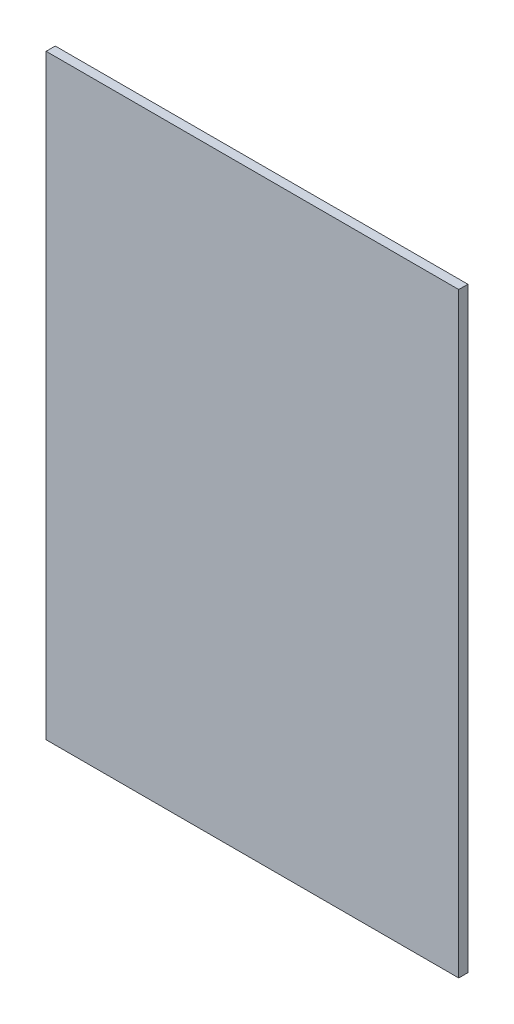
ISO-10303-21;
HEADER;
FILE_DESCRIPTION(('STEP AP214'),'2;1');
FILE_NAME('part.step','',(''),(''),'','','');
FILE_SCHEMA(('AUTOMOTIVE_DESIGN { 1 0 10303 214 1 1 1 1 }'));
ENDSEC;
DATA;
#1=APPLICATION_CONTEXT('core data for automotive mechanical design processes');
#2=APPLICATION_PROTOCOL_DEFINITION('international standard','automotive_design',2000,#1);
#3=PRODUCT_CONTEXT('',#1,'mechanical');
#4=PRODUCT('Part','Part','',(#3));
#5=PRODUCT_RELATED_PRODUCT_CATEGORY('part','',(#4));
#6=PRODUCT_DEFINITION_FORMATION('','',#4);
#7=PRODUCT_DEFINITION_CONTEXT('part definition',#1,'design');
#8=PRODUCT_DEFINITION('design','',#6,#7);
#9=PRODUCT_DEFINITION_SHAPE('','',#8);
#10=(LENGTH_UNIT() NAMED_UNIT(*) SI_UNIT(.MILLI.,.METRE.));
#11=(NAMED_UNIT(*) PLANE_ANGLE_UNIT() SI_UNIT($,.RADIAN.));
#12=(NAMED_UNIT(*) SI_UNIT($,.STERADIAN.) SOLID_ANGLE_UNIT());
#13=UNCERTAINTY_MEASURE_WITH_UNIT(LENGTH_MEASURE(1.E-05),#10,'distance_accuracy_value','');
#14=(GEOMETRIC_REPRESENTATION_CONTEXT(3) GLOBAL_UNCERTAINTY_ASSIGNED_CONTEXT((#13)) GLOBAL_UNIT_ASSIGNED_CONTEXT((#10,
#11,#12)) REPRESENTATION_CONTEXT('',''));
#15=CARTESIAN_POINT('',(0.,0.,0.));
#16=DIRECTION('',(0.,0.,1.));
#17=DIRECTION('',(1.,0.,0.));
#18=AXIS2_PLACEMENT_3D('',#15,#16,#17);
#19=CARTESIAN_POINT('',(-1.15320064,-2.8194,0.3999992));
#20=DIRECTION('',(-1.,0.,0.));
#21=DIRECTION('',(0.,1.,0.));
#22=AXIS2_PLACEMENT_3D('',#19,#20,#21);
#23=PLANE('',#22);
#24=DIRECTION('',(0.,0.,1.));
#25=VECTOR('',#24,1.);
#26=CARTESIAN_POINT('',(-1.15320064,-2.8194,0.3999992));
#27=LINE('',#26,#25);
#28=CARTESIAN_POINT('',(-1.15320064,-2.8194,0.3999992));
#29=VERTEX_POINT('',#28);
#30=CARTESIAN_POINT('',(-1.15320064,-2.8194,0.499999));
#31=VERTEX_POINT('',#30);
#32=EDGE_CURVE('E10',#29,#31,#27,.T.);
#33=ORIENTED_EDGE('',*,*,#32,.T.);
#34=DIRECTION('',(0.,1.,0.));
#35=VECTOR('',#34,1.);
#36=CARTESIAN_POINT('',(-1.15320064,-2.8194,0.499999));
#37=LINE('',#36,#35);
#38=CARTESIAN_POINT('',(-1.15320064,3.69160044,0.499999));
#39=VERTEX_POINT('',#38);
#40=EDGE_CURVE('E23',#31,#39,#37,.T.);
#41=ORIENTED_EDGE('',*,*,#40,.T.);
#42=DIRECTION('',(0.,0.,1.));
#43=VECTOR('',#42,1.);
#44=CARTESIAN_POINT('',(-1.15320064,3.69160044,0.3999992));
#45=LINE('',#44,#43);
#46=CARTESIAN_POINT('',(-1.15320064,3.69160044,0.3999992));
#47=VERTEX_POINT('',#46);
#48=EDGE_CURVE('E82',#47,#39,#45,.T.);
#49=ORIENTED_EDGE('',*,*,#48,.F.);
#50=DIRECTION('',(0.,1.,0.));
#51=VECTOR('',#50,1.);
#52=CARTESIAN_POINT('',(-1.15320064,-2.8194,0.3999992));
#53=LINE('',#52,#51);
#54=EDGE_CURVE('E80',#29,#47,#53,.T.);
#55=ORIENTED_EDGE('',*,*,#54,.F.);
#56=EDGE_LOOP('',(#33,#41,#49,#55));
#57=FACE_BOUND('',#56,.T.);
#58=ADVANCED_FACE('F16',(#57),#23,.T.);
#59=CARTESIAN_POINT('',(-1.15320064,3.69160044,0.3999992));
#60=DIRECTION('',(0.,1.,0.));
#61=DIRECTION('',(1.,0.,0.));
#62=AXIS2_PLACEMENT_3D('',#59,#60,#61);
#63=PLANE('',#62);
#64=ORIENTED_EDGE('',*,*,#48,.T.);
#65=DIRECTION('',(1.,0.,0.));
#66=VECTOR('',#65,1.);
#67=CARTESIAN_POINT('',(-1.15320064,3.69160044,0.499999));
#68=LINE('',#67,#66);
#69=CARTESIAN_POINT('',(3.3528,3.69160044,0.499999));
#70=VERTEX_POINT('',#69);
#71=EDGE_CURVE('E77',#39,#70,#68,.T.);
#72=ORIENTED_EDGE('',*,*,#71,.T.);
#73=DIRECTION('',(0.,0.,1.));
#74=VECTOR('',#73,1.);
#75=CARTESIAN_POINT('',(3.3528,3.69160044,0.3999992));
#76=LINE('',#75,#74);
#77=CARTESIAN_POINT('',(3.3528,3.69160044,0.3999992));
#78=VERTEX_POINT('',#77);
#79=EDGE_CURVE('E75',#78,#70,#76,.T.);
#80=ORIENTED_EDGE('',*,*,#79,.F.);
#81=DIRECTION('',(1.,0.,0.));
#82=VECTOR('',#81,1.);
#83=CARTESIAN_POINT('',(-1.15320064,3.69160044,0.3999992));
#84=LINE('',#83,#82);
#85=EDGE_CURVE('E57',#47,#78,#84,.T.);
#86=ORIENTED_EDGE('',*,*,#85,.F.);
#87=EDGE_LOOP('',(#64,#72,#80,#86));
#88=FACE_BOUND('',#87,.T.);
#89=ADVANCED_FACE('F90',(#88),#63,.T.);
#90=CARTESIAN_POINT('',(3.3528,3.69160044,0.3999992));
#91=DIRECTION('',(1.,0.,0.));
#92=DIRECTION('',(0.,-1.,0.));
#93=AXIS2_PLACEMENT_3D('',#90,#91,#92);
#94=PLANE('',#93);
#95=ORIENTED_EDGE('',*,*,#79,.T.);
#96=DIRECTION('',(0.,-1.,0.));
#97=VECTOR('',#96,1.);
#98=CARTESIAN_POINT('',(3.3528,3.69160044,0.499999));
#99=LINE('',#98,#97);
#100=CARTESIAN_POINT('',(3.3528,-2.8194,0.499999));
#101=VERTEX_POINT('',#100);
#102=EDGE_CURVE('E66',#70,#101,#99,.T.);
#103=ORIENTED_EDGE('',*,*,#102,.T.);
#104=DIRECTION('',(0.,0.,1.));
#105=VECTOR('',#104,1.);
#106=CARTESIAN_POINT('',(3.3528,-2.8194,0.3999992));
#107=LINE('',#106,#105);
#108=CARTESIAN_POINT('',(3.3528,-2.8194,0.3999992));
#109=VERTEX_POINT('',#108);
#110=EDGE_CURVE('E61',#109,#101,#107,.T.);
#111=ORIENTED_EDGE('',*,*,#110,.F.);
#112=DIRECTION('',(0.,-1.,0.));
#113=VECTOR('',#112,1.);
#114=CARTESIAN_POINT('',(3.3528,3.69160044,0.3999992));
#115=LINE('',#114,#113);
#116=EDGE_CURVE('E52',#78,#109,#115,.T.);
#117=ORIENTED_EDGE('',*,*,#116,.F.);
#118=EDGE_LOOP('',(#95,#103,#111,#117));
#119=FACE_BOUND('',#118,.T.);
#120=ADVANCED_FACE('F65',(#119),#94,.T.);
#121=CARTESIAN_POINT('',(3.3528,-2.8194,0.3999992));
#122=DIRECTION('',(0.,-1.,0.));
#123=DIRECTION('',(-1.,0.,0.));
#124=AXIS2_PLACEMENT_3D('',#121,#122,#123);
#125=PLANE('',#124);
#126=ORIENTED_EDGE('',*,*,#110,.T.);
#127=DIRECTION('',(-1.,0.,0.));
#128=VECTOR('',#127,1.);
#129=CARTESIAN_POINT('',(3.3528,-2.8194,0.499999));
#130=LINE('',#129,#128);
#131=EDGE_CURVE('E62',#101,#31,#130,.T.);
#132=ORIENTED_EDGE('',*,*,#131,.T.);
#133=ORIENTED_EDGE('',*,*,#32,.F.);
#134=DIRECTION('',(-1.,0.,0.));
#135=VECTOR('',#134,1.);
#136=CARTESIAN_POINT('',(3.3528,-2.8194,0.3999992));
#137=LINE('',#136,#135);
#138=EDGE_CURVE('E56',#109,#29,#137,.T.);
#139=ORIENTED_EDGE('',*,*,#138,.F.);
#140=EDGE_LOOP('',(#126,#132,#133,#139));
#141=FACE_BOUND('',#140,.T.);
#142=ADVANCED_FACE('F69',(#141),#125,.T.);
#143=CARTESIAN_POINT('',(1.09979968,0.43610022,0.3999992));
#144=DIRECTION('',(0.,0.,-1.));
#145=DIRECTION('',(-1.,0.,0.));
#146=AXIS2_PLACEMENT_3D('',#143,#144,#145);
#147=PLANE('',#146);
#148=ORIENTED_EDGE('',*,*,#54,.T.);
#149=ORIENTED_EDGE('',*,*,#85,.T.);
#150=ORIENTED_EDGE('',*,*,#116,.T.);
#151=ORIENTED_EDGE('',*,*,#138,.T.);
#152=EDGE_LOOP('',(#148,#149,#150,#151));
#153=FACE_BOUND('',#152,.T.);
#154=ADVANCED_FACE('F55',(#153),#147,.T.);
#155=CARTESIAN_POINT('',(1.09979968,0.43610022,0.499999));
#156=DIRECTION('',(0.,0.,-1.));
#157=DIRECTION('',(-1.,0.,0.));
#158=AXIS2_PLACEMENT_3D('',#155,#156,#157);
#159=PLANE('',#158);
#160=ORIENTED_EDGE('',*,*,#131,.F.);
#161=ORIENTED_EDGE('',*,*,#102,.F.);
#162=ORIENTED_EDGE('',*,*,#71,.F.);
#163=ORIENTED_EDGE('',*,*,#40,.F.);
#164=EDGE_LOOP('',(#160,#161,#162,#163));
#165=FACE_BOUND('',#164,.T.);
#166=ADVANCED_FACE('F88',(#165),#159,.F.);
#167=CLOSED_SHELL('',(#58,#89,#120,#142,#154,#166));
#168=MANIFOLD_SOLID_BREP('B1',#167);
#169=ADVANCED_BREP_SHAPE_REPRESENTATION('',(#18,#168),#14);
#170=SHAPE_DEFINITION_REPRESENTATION(#9,#169);
ENDSEC;
END-ISO-10303-21;
